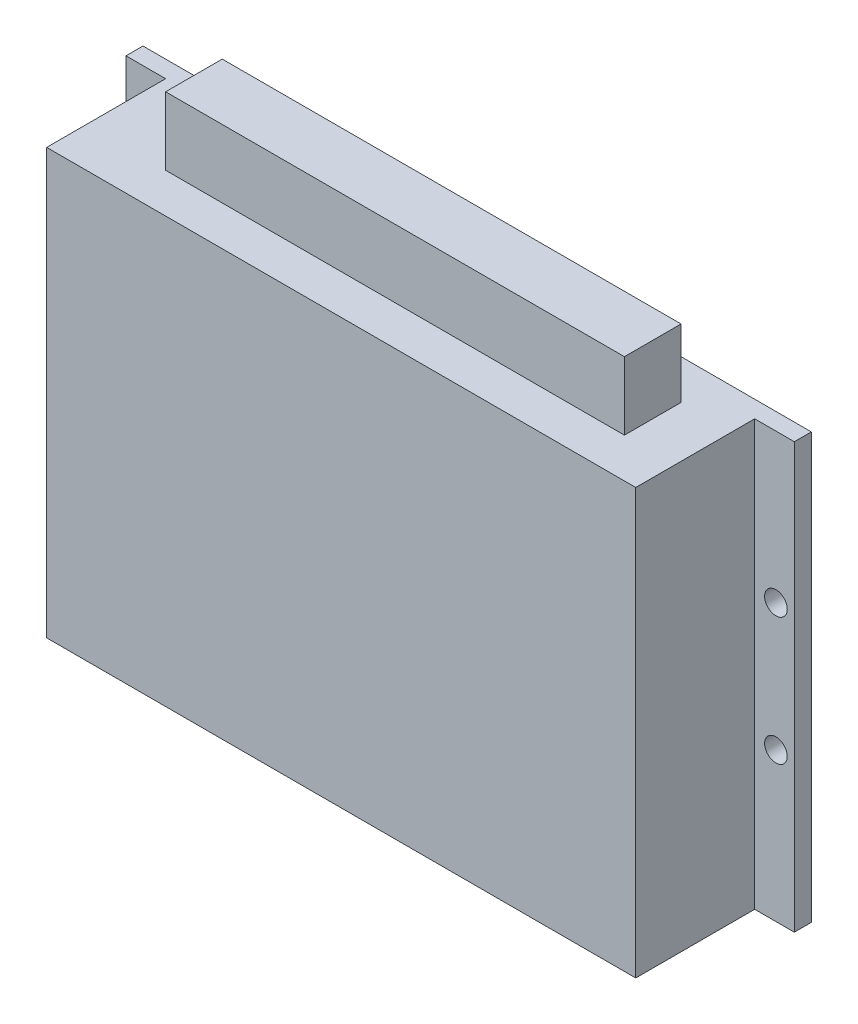
ISO-10303-21;
HEADER;
FILE_DESCRIPTION(('STEP AP214'),'2;1');
FILE_NAME('part.step','',(''),(''),'','','');
FILE_SCHEMA(('AUTOMOTIVE_DESIGN { 1 0 10303 214 1 1 1 1 }'));
ENDSEC;
DATA;
#1=APPLICATION_CONTEXT('core data for automotive mechanical design processes');
#2=APPLICATION_PROTOCOL_DEFINITION('international standard','automotive_design',2000,#1);
#3=PRODUCT_CONTEXT('',#1,'mechanical');
#4=PRODUCT('Part','Part','',(#3));
#5=PRODUCT_RELATED_PRODUCT_CATEGORY('part','',(#4));
#6=PRODUCT_DEFINITION_FORMATION('','',#4);
#7=PRODUCT_DEFINITION_CONTEXT('part definition',#1,'design');
#8=PRODUCT_DEFINITION('design','',#6,#7);
#9=PRODUCT_DEFINITION_SHAPE('','',#8);
#10=(LENGTH_UNIT() NAMED_UNIT(*) SI_UNIT(.MILLI.,.METRE.));
#11=(NAMED_UNIT(*) PLANE_ANGLE_UNIT() SI_UNIT($,.RADIAN.));
#12=(NAMED_UNIT(*) SI_UNIT($,.STERADIAN.) SOLID_ANGLE_UNIT());
#13=UNCERTAINTY_MEASURE_WITH_UNIT(LENGTH_MEASURE(1.E-05),#10,'distance_accuracy_value','');
#14=(GEOMETRIC_REPRESENTATION_CONTEXT(3) GLOBAL_UNCERTAINTY_ASSIGNED_CONTEXT((#13)) GLOBAL_UNIT_ASSIGNED_CONTEXT((#10,
#11,#12)) REPRESENTATION_CONTEXT('',''));
#15=CARTESIAN_POINT('',(0.,0.,0.));
#16=DIRECTION('',(0.,0.,1.));
#17=DIRECTION('',(1.,0.,0.));
#18=AXIS2_PLACEMENT_3D('',#15,#16,#17);
#19=CARTESIAN_POINT('',(21.,12.,-24.));
#20=DIRECTION('',(-1.,0.,0.));
#21=DIRECTION('',(0.,-1.,0.));
#22=AXIS2_PLACEMENT_3D('',#19,#20,#21);
#23=PLANE('',#22);
#24=DIRECTION('',(0.,0.,1.));
#25=VECTOR('',#24,1.);
#26=CARTESIAN_POINT('',(21.,12.,-24.));
#27=LINE('',#26,#25);
#28=CARTESIAN_POINT('',(21.,12.,-17.));
#29=VERTEX_POINT('',#28);
#30=CARTESIAN_POINT('',(21.,12.,-7.));
#31=VERTEX_POINT('',#30);
#32=EDGE_CURVE('E48',#29,#31,#27,.T.);
#33=ORIENTED_EDGE('',*,*,#32,.F.);
#34=DIRECTION('',(0.,-1.,0.));
#35=VECTOR('',#34,1.);
#36=CARTESIAN_POINT('',(21.,12.,-17.));
#37=LINE('',#36,#35);
#38=CARTESIAN_POINT('',(21.,0.,-17.));
#39=VERTEX_POINT('',#38);
#40=EDGE_CURVE('E134',#29,#39,#37,.T.);
#41=ORIENTED_EDGE('',*,*,#40,.T.);
#42=DIRECTION('',(0.,0.,1.));
#43=VECTOR('',#42,1.);
#44=CARTESIAN_POINT('',(21.,0.,-24.));
#45=LINE('',#44,#43);
#46=CARTESIAN_POINT('',(21.,0.,-7.));
#47=VERTEX_POINT('',#46);
#48=EDGE_CURVE('E11',#39,#47,#45,.T.);
#49=ORIENTED_EDGE('',*,*,#48,.T.);
#50=DIRECTION('',(0.,-1.,0.));
#51=VECTOR('',#50,1.);
#52=CARTESIAN_POINT('',(21.,12.,-7.));
#53=LINE('',#52,#51);
#54=EDGE_CURVE('E160',#31,#47,#53,.T.);
#55=ORIENTED_EDGE('',*,*,#54,.F.);
#56=EDGE_LOOP('',(#33,#41,#49,#55));
#57=FACE_BOUND('',#56,.T.);
#58=ADVANCED_FACE('F39',(#57),#23,.T.);
#59=CARTESIAN_POINT('',(102.,12.,-24.));
#60=DIRECTION('',(0.,1.,0.));
#61=DIRECTION('',(-1.,0.,0.));
#62=AXIS2_PLACEMENT_3D('',#59,#60,#61);
#63=PLANE('',#62);
#64=DIRECTION('',(0.,0.,1.));
#65=VECTOR('',#64,1.);
#66=CARTESIAN_POINT('',(102.,12.,-24.));
#67=LINE('',#66,#65);
#68=CARTESIAN_POINT('',(102.,12.,-17.));
#69=VERTEX_POINT('',#68);
#70=CARTESIAN_POINT('',(102.,12.,-7.));
#71=VERTEX_POINT('',#70);
#72=EDGE_CURVE('E216',#69,#71,#67,.T.);
#73=ORIENTED_EDGE('',*,*,#72,.F.);
#74=DIRECTION('',(-1.,0.,0.));
#75=VECTOR('',#74,1.);
#76=CARTESIAN_POINT('',(102.,12.,-17.));
#77=LINE('',#76,#75);
#78=EDGE_CURVE('E147',#69,#29,#77,.T.);
#79=ORIENTED_EDGE('',*,*,#78,.T.);
#80=ORIENTED_EDGE('',*,*,#32,.T.);
#81=DIRECTION('',(-1.,0.,0.));
#82=VECTOR('',#81,1.);
#83=CARTESIAN_POINT('',(102.,12.,-7.));
#84=LINE('',#83,#82);
#85=EDGE_CURVE('E163',#71,#31,#84,.T.);
#86=ORIENTED_EDGE('',*,*,#85,.F.);
#87=EDGE_LOOP('',(#73,#79,#80,#86));
#88=FACE_BOUND('',#87,.T.);
#89=ADVANCED_FACE('F266',(#88),#63,.T.);
#90=CARTESIAN_POINT('',(102.,0.,-24.));
#91=DIRECTION('',(1.,0.,0.));
#92=DIRECTION('',(0.,0.,-1.));
#93=AXIS2_PLACEMENT_3D('',#90,#91,#92);
#94=PLANE('',#93);
#95=DIRECTION('',(0.,0.,1.));
#96=VECTOR('',#95,1.);
#97=CARTESIAN_POINT('',(102.,0.,-24.));
#98=LINE('',#97,#96);
#99=CARTESIAN_POINT('',(102.,0.,-17.));
#100=VERTEX_POINT('',#99);
#101=CARTESIAN_POINT('',(102.,0.,-7.));
#102=VERTEX_POINT('',#101);
#103=EDGE_CURVE('E153',#100,#102,#98,.T.);
#104=ORIENTED_EDGE('',*,*,#103,.F.);
#105=DIRECTION('',(0.,1.,0.));
#106=VECTOR('',#105,1.);
#107=CARTESIAN_POINT('',(102.,0.,-17.));
#108=LINE('',#107,#106);
#109=EDGE_CURVE('E137',#100,#69,#108,.T.);
#110=ORIENTED_EDGE('',*,*,#109,.T.);
#111=ORIENTED_EDGE('',*,*,#72,.T.);
#112=DIRECTION('',(0.,1.,0.));
#113=VECTOR('',#112,1.);
#114=CARTESIAN_POINT('',(102.,0.,-7.));
#115=LINE('',#114,#113);
#116=EDGE_CURVE('E157',#102,#71,#115,.T.);
#117=ORIENTED_EDGE('',*,*,#116,.F.);
#118=EDGE_LOOP('',(#104,#110,#111,#117));
#119=FACE_BOUND('',#118,.T.);
#120=ADVANCED_FACE('F261',(#119),#94,.T.);
#121=CARTESIAN_POINT('',(0.,0.,-24.));
#122=DIRECTION('',(0.,0.,1.));
#123=DIRECTION('',(1.,0.,0.));
#124=AXIS2_PLACEMENT_3D('',#121,#122,#123);
#125=PLANE('',#124);
#126=CARTESIAN_POINT('',(3.24999999999999,-26.25,-24.));
#127=DIRECTION('',(0.,0.,-1.));
#128=DIRECTION('',(1.,0.,0.));
#129=AXIS2_PLACEMENT_3D('',#126,#127,#128);
#130=CIRCLE('',#129,2.);
#131=CARTESIAN_POINT('',(5.24999999999999,-26.25,-24.));
#132=VERTEX_POINT('',#131);
#133=EDGE_CURVE('E336',#132,#132,#130,.T.);
#134=ORIENTED_EDGE('',*,*,#133,.F.);
#135=EDGE_LOOP('',(#134));
#136=FACE_BOUND('',#135,.T.);
#137=CARTESIAN_POINT('',(3.24999999999999,-48.75,-24.));
#138=DIRECTION('',(0.,0.,-1.));
#139=DIRECTION('',(1.,0.,0.));
#140=AXIS2_PLACEMENT_3D('',#137,#138,#139);
#141=CIRCLE('',#140,2.);
#142=CARTESIAN_POINT('',(5.24999999999999,-48.75,-24.));
#143=VERTEX_POINT('',#142);
#144=EDGE_CURVE('E327',#143,#143,#141,.T.);
#145=ORIENTED_EDGE('',*,*,#144,.F.);
#146=EDGE_LOOP('',(#145));
#147=FACE_BOUND('',#146,.T.);
#148=CARTESIAN_POINT('',(114.75,-48.75,-24.));
#149=DIRECTION('',(0.,0.,-1.));
#150=DIRECTION('',(-1.,0.,0.));
#151=AXIS2_PLACEMENT_3D('',#148,#149,#150);
#152=CIRCLE('',#151,2.);
#153=CARTESIAN_POINT('',(112.75,-48.75,-24.));
#154=VERTEX_POINT('',#153);
#155=EDGE_CURVE('E323',#154,#154,#152,.T.);
#156=ORIENTED_EDGE('',*,*,#155,.F.);
#157=EDGE_LOOP('',(#156));
#158=FACE_BOUND('',#157,.T.);
#159=CARTESIAN_POINT('',(114.75,-26.25,-24.));
#160=DIRECTION('',(0.,0.,-1.));
#161=DIRECTION('',(-1.,0.,0.));
#162=AXIS2_PLACEMENT_3D('',#159,#160,#161);
#163=CIRCLE('',#162,2.);
#164=CARTESIAN_POINT('',(112.75,-26.25,-24.));
#165=VERTEX_POINT('',#164);
#166=EDGE_CURVE('E329',#165,#165,#163,.T.);
#167=ORIENTED_EDGE('',*,*,#166,.F.);
#168=EDGE_LOOP('',(#167));
#169=FACE_BOUND('',#168,.T.);
#170=DIRECTION('',(-1.,0.,0.));
#171=VECTOR('',#170,1.);
#172=CARTESIAN_POINT('',(21.,0.,-24.));
#173=LINE('',#172,#171);
#174=CARTESIAN_POINT('',(118.,0.,-24.));
#175=VERTEX_POINT('',#174);
#176=CARTESIAN_POINT('',(0.,0.,-24.));
#177=VERTEX_POINT('',#176);
#178=EDGE_CURVE('E199',#175,#177,#173,.T.);
#179=ORIENTED_EDGE('',*,*,#178,.F.);
#180=DIRECTION('',(0.,1.,0.));
#181=VECTOR('',#180,1.);
#182=CARTESIAN_POINT('',(118.,-75.,-24.));
#183=LINE('',#182,#181);
#184=CARTESIAN_POINT('',(118.,-75.,-24.));
#185=VERTEX_POINT('',#184);
#186=EDGE_CURVE('E209',#185,#175,#183,.T.);
#187=ORIENTED_EDGE('',*,*,#186,.F.);
#188=DIRECTION('',(1.,0.,0.));
#189=VECTOR('',#188,1.);
#190=CARTESIAN_POINT('',(0.,-75.,-24.));
#191=LINE('',#190,#189);
#192=CARTESIAN_POINT('',(0.,-75.,-24.));
#193=VERTEX_POINT('',#192);
#194=EDGE_CURVE('E206',#193,#185,#191,.T.);
#195=ORIENTED_EDGE('',*,*,#194,.F.);
#196=DIRECTION('',(0.,-1.,0.));
#197=VECTOR('',#196,1.);
#198=CARTESIAN_POINT('',(0.,0.,-24.));
#199=LINE('',#198,#197);
#200=EDGE_CURVE('E202',#177,#193,#199,.T.);
#201=ORIENTED_EDGE('',*,*,#200,.F.);
#202=EDGE_LOOP('',(#179,#187,#195,#201));
#203=FACE_BOUND('',#202,.T.);
#204=ADVANCED_FACE('F234',(#136,#147,#158,#169,#203),#125,.F.);
#205=CARTESIAN_POINT('',(118.,-75.,-24.));
#206=DIRECTION('',(1.,0.,0.));
#207=DIRECTION('',(0.,0.,-1.));
#208=AXIS2_PLACEMENT_3D('',#205,#206,#207);
#209=PLANE('',#208);
#210=DIRECTION('',(0.,0.,1.));
#211=VECTOR('',#210,1.);
#212=CARTESIAN_POINT('',(118.,0.,-24.));
#213=LINE('',#212,#211);
#214=CARTESIAN_POINT('',(118.,0.,-21.));
#215=VERTEX_POINT('',#214);
#216=EDGE_CURVE('E219',#175,#215,#213,.T.);
#217=ORIENTED_EDGE('',*,*,#216,.T.);
#218=DIRECTION('',(0.,1.,0.));
#219=VECTOR('',#218,1.);
#220=CARTESIAN_POINT('',(118.,-75.,-21.));
#221=LINE('',#220,#219);
#222=CARTESIAN_POINT('',(118.,-75.,-21.));
#223=VERTEX_POINT('',#222);
#224=EDGE_CURVE('E187',#223,#215,#221,.T.);
#225=ORIENTED_EDGE('',*,*,#224,.F.);
#226=DIRECTION('',(0.,0.,1.));
#227=VECTOR('',#226,1.);
#228=CARTESIAN_POINT('',(118.,-75.,-24.));
#229=LINE('',#228,#227);
#230=EDGE_CURVE('E222',#185,#223,#229,.T.);
#231=ORIENTED_EDGE('',*,*,#230,.F.);
#232=ORIENTED_EDGE('',*,*,#186,.T.);
#233=EDGE_LOOP('',(#217,#225,#231,#232));
#234=FACE_BOUND('',#233,.T.);
#235=ADVANCED_FACE('F254',(#234),#209,.T.);
#236=CARTESIAN_POINT('',(0.,0.,-24.));
#237=DIRECTION('',(-1.,0.,0.));
#238=DIRECTION('',(0.,0.,1.));
#239=AXIS2_PLACEMENT_3D('',#236,#237,#238);
#240=PLANE('',#239);
#241=DIRECTION('',(0.,0.,1.));
#242=VECTOR('',#241,1.);
#243=CARTESIAN_POINT('',(0.,-75.,-24.));
#244=LINE('',#243,#242);
#245=CARTESIAN_POINT('',(0.,-75.,-21.));
#246=VERTEX_POINT('',#245);
#247=EDGE_CURVE('E224',#193,#246,#244,.T.);
#248=ORIENTED_EDGE('',*,*,#247,.T.);
#249=DIRECTION('',(0.,-1.,0.));
#250=VECTOR('',#249,1.);
#251=CARTESIAN_POINT('',(0.,0.,-21.));
#252=LINE('',#251,#250);
#253=CARTESIAN_POINT('',(0.,0.,-21.));
#254=VERTEX_POINT('',#253);
#255=EDGE_CURVE('E174',#254,#246,#252,.T.);
#256=ORIENTED_EDGE('',*,*,#255,.F.);
#257=DIRECTION('',(0.,0.,1.));
#258=VECTOR('',#257,1.);
#259=CARTESIAN_POINT('',(0.,0.,-24.));
#260=LINE('',#259,#258);
#261=EDGE_CURVE('E43',#177,#254,#260,.T.);
#262=ORIENTED_EDGE('',*,*,#261,.F.);
#263=ORIENTED_EDGE('',*,*,#200,.T.);
#264=EDGE_LOOP('',(#248,#256,#262,#263));
#265=FACE_BOUND('',#264,.T.);
#266=ADVANCED_FACE('F41',(#265),#240,.T.);
#267=CARTESIAN_POINT('',(118.,0.,-24.));
#268=DIRECTION('',(0.,1.,0.));
#269=DIRECTION('',(-1.,0.,0.));
#270=AXIS2_PLACEMENT_3D('',#267,#268,#269);
#271=PLANE('',#270);
#272=DIRECTION('',(1.,0.,0.));
#273=VECTOR('',#272,1.);
#274=CARTESIAN_POINT('',(21.,0.,-17.));
#275=LINE('',#274,#273);
#276=EDGE_CURVE('E131',#39,#100,#275,.T.);
#277=ORIENTED_EDGE('',*,*,#276,.T.);
#278=ORIENTED_EDGE('',*,*,#103,.T.);
#279=DIRECTION('',(1.,0.,0.));
#280=VECTOR('',#279,1.);
#281=CARTESIAN_POINT('',(21.,0.,-7.));
#282=LINE('',#281,#280);
#283=EDGE_CURVE('E151',#47,#102,#282,.T.);
#284=ORIENTED_EDGE('',*,*,#283,.F.);
#285=ORIENTED_EDGE('',*,*,#48,.F.);
#286=EDGE_LOOP('',(#277,#278,#284,#285));
#287=FACE_BOUND('',#286,.T.);
#288=DIRECTION('',(0.,0.,1.));
#289=VECTOR('',#288,1.);
#290=CARTESIAN_POINT('',(111.,0.,-21.));
#291=LINE('',#290,#289);
#292=CARTESIAN_POINT('',(111.,0.,-21.));
#293=VERTEX_POINT('',#292);
#294=CARTESIAN_POINT('',(111.,0.,0.));
#295=VERTEX_POINT('',#294);
#296=EDGE_CURVE('E167',#293,#295,#291,.T.);
#297=ORIENTED_EDGE('',*,*,#296,.F.);
#298=DIRECTION('',(-1.,0.,0.));
#299=VECTOR('',#298,1.);
#300=CARTESIAN_POINT('',(118.,0.,-21.));
#301=LINE('',#300,#299);
#302=EDGE_CURVE('E190',#215,#293,#301,.T.);
#303=ORIENTED_EDGE('',*,*,#302,.F.);
#304=ORIENTED_EDGE('',*,*,#216,.F.);
#305=ORIENTED_EDGE('',*,*,#178,.T.);
#306=ORIENTED_EDGE('',*,*,#261,.T.);
#307=DIRECTION('',(-1.,0.,0.));
#308=VECTOR('',#307,1.);
#309=CARTESIAN_POINT('',(7.,0.,-21.));
#310=LINE('',#309,#308);
#311=CARTESIAN_POINT('',(7.,0.,-21.));
#312=VERTEX_POINT('',#311);
#313=EDGE_CURVE('E172',#312,#254,#310,.T.);
#314=ORIENTED_EDGE('',*,*,#313,.F.);
#315=DIRECTION('',(0.,0.,1.));
#316=VECTOR('',#315,1.);
#317=CARTESIAN_POINT('',(7.,0.,-21.));
#318=LINE('',#317,#316);
#319=CARTESIAN_POINT('',(7.,0.,0.));
#320=VERTEX_POINT('',#319);
#321=EDGE_CURVE('E184',#312,#320,#318,.T.);
#322=ORIENTED_EDGE('',*,*,#321,.T.);
#323=DIRECTION('',(-1.,0.,0.));
#324=VECTOR('',#323,1.);
#325=CARTESIAN_POINT('',(21.,0.,0.));
#326=LINE('',#325,#324);
#327=EDGE_CURVE('E56',#295,#320,#326,.T.);
#328=ORIENTED_EDGE('',*,*,#327,.F.);
#329=EDGE_LOOP('',(#297,#303,#304,#305,#306,#314,#322,#328));
#330=FACE_BOUND('',#329,.T.);
#331=ADVANCED_FACE('F149',(#287,#330),#271,.T.);
#332=CARTESIAN_POINT('',(0.,-75.,-24.));
#333=DIRECTION('',(0.,-1.,0.));
#334=DIRECTION('',(0.,0.,-1.));
#335=AXIS2_PLACEMENT_3D('',#332,#333,#334);
#336=PLANE('',#335);
#337=DIRECTION('',(0.,0.,1.));
#338=VECTOR('',#337,1.);
#339=CARTESIAN_POINT('',(7.00000000000001,-75.,-21.));
#340=LINE('',#339,#338);
#341=CARTESIAN_POINT('',(7.00000000000001,-75.,-21.));
#342=VERTEX_POINT('',#341);
#343=CARTESIAN_POINT('',(7.00000000000001,-75.,0.));
#344=VERTEX_POINT('',#343);
#345=EDGE_CURVE('E64',#342,#344,#340,.T.);
#346=ORIENTED_EDGE('',*,*,#345,.F.);
#347=DIRECTION('',(1.,0.,0.));
#348=VECTOR('',#347,1.);
#349=CARTESIAN_POINT('',(0.,-75.,-21.));
#350=LINE('',#349,#348);
#351=EDGE_CURVE('E177',#246,#342,#350,.T.);
#352=ORIENTED_EDGE('',*,*,#351,.F.);
#353=ORIENTED_EDGE('',*,*,#247,.F.);
#354=ORIENTED_EDGE('',*,*,#194,.T.);
#355=ORIENTED_EDGE('',*,*,#230,.T.);
#356=DIRECTION('',(1.,0.,0.));
#357=VECTOR('',#356,1.);
#358=CARTESIAN_POINT('',(111.,-75.,-21.));
#359=LINE('',#358,#357);
#360=CARTESIAN_POINT('',(111.,-75.,-21.));
#361=VERTEX_POINT('',#360);
#362=EDGE_CURVE('E192',#361,#223,#359,.T.);
#363=ORIENTED_EDGE('',*,*,#362,.F.);
#364=DIRECTION('',(0.,0.,1.));
#365=VECTOR('',#364,1.);
#366=CARTESIAN_POINT('',(111.,-75.,-21.));
#367=LINE('',#366,#365);
#368=CARTESIAN_POINT('',(111.,-75.,0.));
#369=VERTEX_POINT('',#368);
#370=EDGE_CURVE('E164',#361,#369,#367,.T.);
#371=ORIENTED_EDGE('',*,*,#370,.T.);
#372=DIRECTION('',(1.,0.,0.));
#373=VECTOR('',#372,1.);
#374=CARTESIAN_POINT('',(0.,-75.,0.));
#375=LINE('',#374,#373);
#376=EDGE_CURVE('E203',#344,#369,#375,.T.);
#377=ORIENTED_EDGE('',*,*,#376,.F.);
#378=EDGE_LOOP('',(#346,#352,#353,#354,#355,#363,#371,#377));
#379=FACE_BOUND('',#378,.T.);
#380=ADVANCED_FACE('F237',(#379),#336,.T.);
#381=CARTESIAN_POINT('',(0.,0.,0.));
#382=DIRECTION('',(0.,0.,1.));
#383=DIRECTION('',(1.,0.,0.));
#384=AXIS2_PLACEMENT_3D('',#381,#382,#383);
#385=PLANE('',#384);
#386=DIRECTION('',(0.,-1.,0.));
#387=VECTOR('',#386,1.);
#388=CARTESIAN_POINT('',(111.,0.,0.));
#389=LINE('',#388,#387);
#390=EDGE_CURVE('E183',#295,#369,#389,.T.);
#391=ORIENTED_EDGE('',*,*,#390,.F.);
#392=ORIENTED_EDGE('',*,*,#327,.T.);
#393=DIRECTION('',(0.,1.,0.));
#394=VECTOR('',#393,1.);
#395=CARTESIAN_POINT('',(7.,0.,0.));
#396=LINE('',#395,#394);
#397=EDGE_CURVE('E175',#344,#320,#396,.T.);
#398=ORIENTED_EDGE('',*,*,#397,.F.);
#399=ORIENTED_EDGE('',*,*,#376,.T.);
#400=EDGE_LOOP('',(#391,#392,#398,#399));
#401=FACE_BOUND('',#400,.T.);
#402=ADVANCED_FACE('F246',(#401),#385,.T.);
#403=CARTESIAN_POINT('',(111.,0.,-21.));
#404=DIRECTION('',(-1.,0.,0.));
#405=DIRECTION('',(0.,-1.,0.));
#406=AXIS2_PLACEMENT_3D('',#403,#404,#405);
#407=PLANE('',#406);
#408=ORIENTED_EDGE('',*,*,#390,.T.);
#409=ORIENTED_EDGE('',*,*,#370,.F.);
#410=DIRECTION('',(0.,-1.,0.));
#411=VECTOR('',#410,1.);
#412=CARTESIAN_POINT('',(111.,0.,-21.));
#413=LINE('',#412,#411);
#414=EDGE_CURVE('E194',#293,#361,#413,.T.);
#415=ORIENTED_EDGE('',*,*,#414,.F.);
#416=ORIENTED_EDGE('',*,*,#296,.T.);
#417=EDGE_LOOP('',(#408,#409,#415,#416));
#418=FACE_BOUND('',#417,.T.);
#419=ADVANCED_FACE('F248',(#418),#407,.F.);
#420=CARTESIAN_POINT('',(0.,0.,-21.));
#421=DIRECTION('',(0.,0.,1.));
#422=DIRECTION('',(1.,0.,0.));
#423=AXIS2_PLACEMENT_3D('',#420,#421,#422);
#424=PLANE('',#423);
#425=CARTESIAN_POINT('',(114.75,-48.75,-21.));
#426=DIRECTION('',(0.,0.,1.));
#427=DIRECTION('',(1.,0.,0.));
#428=AXIS2_PLACEMENT_3D('',#425,#426,#427);
#429=CIRCLE('',#428,2.);
#430=CARTESIAN_POINT('',(116.75,-48.75,-21.));
#431=VERTEX_POINT('',#430);
#432=EDGE_CURVE('E326',#431,#431,#429,.F.);
#433=ORIENTED_EDGE('',*,*,#432,.T.);
#434=EDGE_LOOP('',(#433));
#435=FACE_BOUND('',#434,.T.);
#436=CARTESIAN_POINT('',(114.75,-26.25,-21.));
#437=DIRECTION('',(0.,0.,1.));
#438=DIRECTION('',(1.,0.,0.));
#439=AXIS2_PLACEMENT_3D('',#436,#437,#438);
#440=CIRCLE('',#439,2.);
#441=CARTESIAN_POINT('',(116.75,-26.25,-21.));
#442=VERTEX_POINT('',#441);
#443=EDGE_CURVE('E141',#442,#442,#440,.F.);
#444=ORIENTED_EDGE('',*,*,#443,.T.);
#445=EDGE_LOOP('',(#444));
#446=FACE_BOUND('',#445,.T.);
#447=ORIENTED_EDGE('',*,*,#302,.T.);
#448=ORIENTED_EDGE('',*,*,#414,.T.);
#449=ORIENTED_EDGE('',*,*,#362,.T.);
#450=ORIENTED_EDGE('',*,*,#224,.T.);
#451=EDGE_LOOP('',(#447,#448,#449,#450));
#452=FACE_BOUND('',#451,.T.);
#453=ADVANCED_FACE('F251',(#435,#446,#452),#424,.T.);
#454=CARTESIAN_POINT('',(7.,0.,-21.));
#455=DIRECTION('',(1.,0.,0.));
#456=DIRECTION('',(0.,1.,0.));
#457=AXIS2_PLACEMENT_3D('',#454,#455,#456);
#458=PLANE('',#457);
#459=ORIENTED_EDGE('',*,*,#397,.T.);
#460=ORIENTED_EDGE('',*,*,#321,.F.);
#461=DIRECTION('',(0.,1.,0.));
#462=VECTOR('',#461,1.);
#463=CARTESIAN_POINT('',(7.,0.,-21.));
#464=LINE('',#463,#462);
#465=EDGE_CURVE('E179',#342,#312,#464,.T.);
#466=ORIENTED_EDGE('',*,*,#465,.F.);
#467=ORIENTED_EDGE('',*,*,#345,.T.);
#468=EDGE_LOOP('',(#459,#460,#466,#467));
#469=FACE_BOUND('',#468,.T.);
#470=ADVANCED_FACE('F243',(#469),#458,.F.);
#471=CARTESIAN_POINT('',(0.,0.,-21.));
#472=DIRECTION('',(0.,0.,1.));
#473=DIRECTION('',(1.,0.,0.));
#474=AXIS2_PLACEMENT_3D('',#471,#472,#473);
#475=PLANE('',#474);
#476=CARTESIAN_POINT('',(3.24999999999999,-26.25,-21.));
#477=DIRECTION('',(0.,0.,1.));
#478=DIRECTION('',(1.,0.,0.));
#479=AXIS2_PLACEMENT_3D('',#476,#477,#478);
#480=CIRCLE('',#479,2.);
#481=CARTESIAN_POINT('',(5.24999999999999,-26.25,-21.));
#482=VERTEX_POINT('',#481);
#483=EDGE_CURVE('E338',#482,#482,#480,.F.);
#484=ORIENTED_EDGE('',*,*,#483,.T.);
#485=EDGE_LOOP('',(#484));
#486=FACE_BOUND('',#485,.T.);
#487=CARTESIAN_POINT('',(3.24999999999999,-48.75,-21.));
#488=DIRECTION('',(0.,0.,1.));
#489=DIRECTION('',(1.,0.,0.));
#490=AXIS2_PLACEMENT_3D('',#487,#488,#489);
#491=CIRCLE('',#490,2.);
#492=CARTESIAN_POINT('',(5.24999999999999,-48.75,-21.));
#493=VERTEX_POINT('',#492);
#494=EDGE_CURVE('E332',#493,#493,#491,.F.);
#495=ORIENTED_EDGE('',*,*,#494,.T.);
#496=EDGE_LOOP('',(#495));
#497=FACE_BOUND('',#496,.T.);
#498=ORIENTED_EDGE('',*,*,#313,.T.);
#499=ORIENTED_EDGE('',*,*,#255,.T.);
#500=ORIENTED_EDGE('',*,*,#351,.T.);
#501=ORIENTED_EDGE('',*,*,#465,.T.);
#502=EDGE_LOOP('',(#498,#499,#500,#501));
#503=FACE_BOUND('',#502,.T.);
#504=ADVANCED_FACE('F242',(#486,#497,#503),#475,.T.);
#505=CARTESIAN_POINT('',(0.,0.,-7.));
#506=DIRECTION('',(0.,0.,1.));
#507=DIRECTION('',(1.,0.,0.));
#508=AXIS2_PLACEMENT_3D('',#505,#506,#507);
#509=PLANE('',#508);
#510=ORIENTED_EDGE('',*,*,#283,.T.);
#511=ORIENTED_EDGE('',*,*,#116,.T.);
#512=ORIENTED_EDGE('',*,*,#85,.T.);
#513=ORIENTED_EDGE('',*,*,#54,.T.);
#514=EDGE_LOOP('',(#510,#511,#512,#513));
#515=FACE_BOUND('',#514,.T.);
#516=ADVANCED_FACE('F161',(#515),#509,.T.);
#517=CARTESIAN_POINT('',(0.,0.,-17.));
#518=DIRECTION('',(0.,0.,-1.));
#519=DIRECTION('',(1.,0.,0.));
#520=AXIS2_PLACEMENT_3D('',#517,#518,#519);
#521=PLANE('',#520);
#522=ORIENTED_EDGE('',*,*,#276,.F.);
#523=ORIENTED_EDGE('',*,*,#40,.F.);
#524=ORIENTED_EDGE('',*,*,#78,.F.);
#525=ORIENTED_EDGE('',*,*,#109,.F.);
#526=EDGE_LOOP('',(#522,#523,#524,#525));
#527=FACE_BOUND('',#526,.T.);
#528=ADVANCED_FACE('F133',(#527),#521,.T.);
#529=CARTESIAN_POINT('',(3.24999999999999,-48.75,-15.3431457505076));
#530=DIRECTION('',(0.,0.,-1.));
#531=DIRECTION('',(-1.,0.,0.));
#532=AXIS2_PLACEMENT_3D('',#529,#530,#531);
#533=CYLINDRICAL_SURFACE('',#532,2.);
#534=ORIENTED_EDGE('',*,*,#144,.T.);
#535=EDGE_LOOP('',(#534));
#536=FACE_BOUND('',#535,.T.);
#537=ORIENTED_EDGE('',*,*,#494,.F.);
#538=EDGE_LOOP('',(#537));
#539=FACE_BOUND('',#538,.T.);
#540=ADVANCED_FACE('F303',(#536,#539),#533,.F.);
#541=CARTESIAN_POINT('',(3.24999999999999,-26.25,-15.3431457505076));
#542=DIRECTION('',(0.,0.,-1.));
#543=DIRECTION('',(-1.,0.,0.));
#544=AXIS2_PLACEMENT_3D('',#541,#542,#543);
#545=CYLINDRICAL_SURFACE('',#544,2.);
#546=ORIENTED_EDGE('',*,*,#133,.T.);
#547=EDGE_LOOP('',(#546));
#548=FACE_BOUND('',#547,.T.);
#549=ORIENTED_EDGE('',*,*,#483,.F.);
#550=EDGE_LOOP('',(#549));
#551=FACE_BOUND('',#550,.T.);
#552=ADVANCED_FACE('F308',(#548,#551),#545,.F.);
#553=CARTESIAN_POINT('',(114.75,-26.25,-15.3431457505076));
#554=DIRECTION('',(0.,0.,-1.));
#555=DIRECTION('',(-1.,0.,0.));
#556=AXIS2_PLACEMENT_3D('',#553,#554,#555);
#557=CYLINDRICAL_SURFACE('',#556,2.);
#558=ORIENTED_EDGE('',*,*,#166,.T.);
#559=EDGE_LOOP('',(#558));
#560=FACE_BOUND('',#559,.T.);
#561=ORIENTED_EDGE('',*,*,#443,.F.);
#562=EDGE_LOOP('',(#561));
#563=FACE_BOUND('',#562,.T.);
#564=ADVANCED_FACE('F304',(#560,#563),#557,.F.);
#565=CARTESIAN_POINT('',(114.75,-48.75,-15.3431457505076));
#566=DIRECTION('',(0.,0.,-1.));
#567=DIRECTION('',(-1.,0.,0.));
#568=AXIS2_PLACEMENT_3D('',#565,#566,#567);
#569=CYLINDRICAL_SURFACE('',#568,2.);
#570=ORIENTED_EDGE('',*,*,#155,.T.);
#571=EDGE_LOOP('',(#570));
#572=FACE_BOUND('',#571,.T.);
#573=ORIENTED_EDGE('',*,*,#432,.F.);
#574=EDGE_LOOP('',(#573));
#575=FACE_BOUND('',#574,.T.);
#576=ADVANCED_FACE('F307',(#572,#575),#569,.F.);
#577=CLOSED_SHELL('',(#58,#89,#120,#204,#235,#266,#331,#380,#402,#419,#453,#470,#504,#516,#528,
#540,#552,#564,#576));
#578=MANIFOLD_SOLID_BREP('B2',#577);
#579=ADVANCED_BREP_SHAPE_REPRESENTATION('',(#18,#578),#14);
#580=SHAPE_DEFINITION_REPRESENTATION(#9,#579);
ENDSEC;
END-ISO-10303-21;
